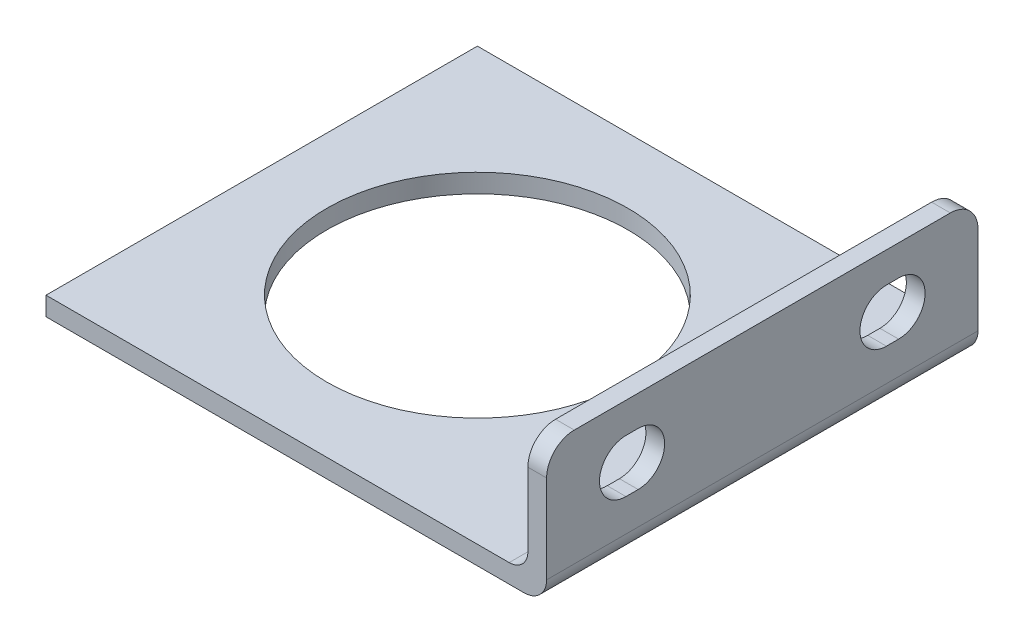
ISO-10303-21;
HEADER;
FILE_DESCRIPTION(('STEP AP214'),'2;1');
FILE_NAME('part.step','',(''),(''),'','','');
FILE_SCHEMA(('AUTOMOTIVE_DESIGN { 1 0 10303 214 1 1 1 1 }'));
ENDSEC;
DATA;
#1=APPLICATION_CONTEXT('core data for automotive mechanical design processes');
#2=APPLICATION_PROTOCOL_DEFINITION('international standard','automotive_design',2000,#1);
#3=PRODUCT_CONTEXT('',#1,'mechanical');
#4=PRODUCT('Part','Part','',(#3));
#5=PRODUCT_RELATED_PRODUCT_CATEGORY('part','',(#4));
#6=PRODUCT_DEFINITION_FORMATION('','',#4);
#7=PRODUCT_DEFINITION_CONTEXT('part definition',#1,'design');
#8=PRODUCT_DEFINITION('design','',#6,#7);
#9=PRODUCT_DEFINITION_SHAPE('','',#8);
#10=(LENGTH_UNIT() NAMED_UNIT(*) SI_UNIT(.MILLI.,.METRE.));
#11=(NAMED_UNIT(*) PLANE_ANGLE_UNIT() SI_UNIT($,.RADIAN.));
#12=(NAMED_UNIT(*) SI_UNIT($,.STERADIAN.) SOLID_ANGLE_UNIT());
#13=UNCERTAINTY_MEASURE_WITH_UNIT(LENGTH_MEASURE(1.E-05),#10,'distance_accuracy_value','');
#14=(GEOMETRIC_REPRESENTATION_CONTEXT(3) GLOBAL_UNCERTAINTY_ASSIGNED_CONTEXT((#13)) GLOBAL_UNIT_ASSIGNED_CONTEXT((#10,
#11,#12)) REPRESENTATION_CONTEXT('',''));
#15=CARTESIAN_POINT('',(0.,0.,0.));
#16=DIRECTION('',(0.,0.,1.));
#17=DIRECTION('',(1.,0.,0.));
#18=AXIS2_PLACEMENT_3D('',#15,#16,#17);
#19=CARTESIAN_POINT('',(35.,2.76,26.5));
#20=DIRECTION('',(-1.,0.,0.));
#21=DIRECTION('',(0.,0.,1.));
#22=AXIS2_PLACEMENT_3D('',#19,#20,#21);
#23=PLANE('',#22);
#24=CARTESIAN_POINT('',(35.,10.,-15.25));
#25=DIRECTION('',(1.,0.,0.));
#26=DIRECTION('',(0.,0.,-1.));
#27=AXIS2_PLACEMENT_3D('',#24,#25,#26);
#28=CIRCLE('',#27,3.25);
#29=CARTESIAN_POINT('',(35.,13.25,-15.25));
#30=VERTEX_POINT('',#29);
#31=CARTESIAN_POINT('',(35.,6.75,-15.25));
#32=VERTEX_POINT('',#31);
#33=EDGE_CURVE('E206',#30,#32,#28,.T.);
#34=ORIENTED_EDGE('',*,*,#33,.F.);
#35=DIRECTION('',(0.,0.,1.));
#36=VECTOR('',#35,1.);
#37=CARTESIAN_POINT('',(35.,13.25,-16.75));
#38=LINE('',#37,#36);
#39=CARTESIAN_POINT('',(35.,13.25,-16.75));
#40=VERTEX_POINT('',#39);
#41=EDGE_CURVE('E213',#40,#30,#38,.T.);
#42=ORIENTED_EDGE('',*,*,#41,.F.);
#43=CARTESIAN_POINT('',(35.,10.,-16.75));
#44=DIRECTION('',(1.,0.,0.));
#45=DIRECTION('',(0.,0.,-1.));
#46=AXIS2_PLACEMENT_3D('',#43,#44,#45);
#47=CIRCLE('',#46,3.25);
#48=CARTESIAN_POINT('',(35.,6.75,-16.75));
#49=VERTEX_POINT('',#48);
#50=EDGE_CURVE('E228',#49,#40,#47,.T.);
#51=ORIENTED_EDGE('',*,*,#50,.F.);
#52=DIRECTION('',(0.,0.,-1.));
#53=VECTOR('',#52,1.);
#54=CARTESIAN_POINT('',(35.,6.75,-15.25));
#55=LINE('',#54,#53);
#56=EDGE_CURVE('E225',#32,#49,#55,.T.);
#57=ORIENTED_EDGE('',*,*,#56,.F.);
#58=EDGE_LOOP('',(#34,#42,#51,#57));
#59=FACE_BOUND('',#58,.T.);
#60=CARTESIAN_POINT('',(35.,10.,16.75));
#61=DIRECTION('',(1.,0.,0.));
#62=DIRECTION('',(0.,0.,-1.));
#63=AXIS2_PLACEMENT_3D('',#60,#61,#62);
#64=CIRCLE('',#63,3.25);
#65=CARTESIAN_POINT('',(35.,13.25,16.75));
#66=VERTEX_POINT('',#65);
#67=CARTESIAN_POINT('',(35.,6.75,16.75));
#68=VERTEX_POINT('',#67);
#69=EDGE_CURVE('E235',#66,#68,#64,.T.);
#70=ORIENTED_EDGE('',*,*,#69,.F.);
#71=DIRECTION('',(0.,0.,1.));
#72=VECTOR('',#71,1.);
#73=CARTESIAN_POINT('',(35.,13.25,15.25));
#74=LINE('',#73,#72);
#75=CARTESIAN_POINT('',(35.,13.25,15.25));
#76=VERTEX_POINT('',#75);
#77=EDGE_CURVE('E245',#76,#66,#74,.T.);
#78=ORIENTED_EDGE('',*,*,#77,.F.);
#79=CARTESIAN_POINT('',(35.,10.,15.25));
#80=DIRECTION('',(1.,0.,0.));
#81=DIRECTION('',(0.,0.,-1.));
#82=AXIS2_PLACEMENT_3D('',#79,#80,#81);
#83=CIRCLE('',#82,3.25);
#84=CARTESIAN_POINT('',(35.,6.75,15.25));
#85=VERTEX_POINT('',#84);
#86=EDGE_CURVE('E260',#85,#76,#83,.T.);
#87=ORIENTED_EDGE('',*,*,#86,.F.);
#88=DIRECTION('',(0.,0.,-1.));
#89=VECTOR('',#88,1.);
#90=CARTESIAN_POINT('',(35.,6.75,16.75));
#91=LINE('',#90,#89);
#92=EDGE_CURVE('E257',#68,#85,#91,.T.);
#93=ORIENTED_EDGE('',*,*,#92,.F.);
#94=EDGE_LOOP('',(#70,#78,#87,#93));
#95=FACE_BOUND('',#94,.T.);
#96=CARTESIAN_POINT('',(35.,13.6,23.1));
#97=DIRECTION('',(1.,0.,0.));
#98=DIRECTION('',(0.,0.,-1.));
#99=AXIS2_PLACEMENT_3D('',#96,#97,#98);
#100=CIRCLE('',#99,3.39999999999999);
#101=CARTESIAN_POINT('',(35.,17.,23.1));
#102=VERTEX_POINT('',#101);
#103=CARTESIAN_POINT('',(35.,13.6,26.5));
#104=VERTEX_POINT('',#103);
#105=EDGE_CURVE('E163',#102,#104,#100,.T.);
#106=ORIENTED_EDGE('',*,*,#105,.T.);
#107=DIRECTION('',(0.,1.,0.));
#108=VECTOR('',#107,1.);
#109=CARTESIAN_POINT('',(35.,2.76,26.5));
#110=LINE('',#109,#108);
#111=CARTESIAN_POINT('',(35.,2.76,26.5));
#112=VERTEX_POINT('',#111);
#113=EDGE_CURVE('E293',#112,#104,#110,.T.);
#114=ORIENTED_EDGE('',*,*,#113,.F.);
#115=DIRECTION('',(0.,0.,-1.));
#116=VECTOR('',#115,1.);
#117=CARTESIAN_POINT('',(35.,2.76,26.5));
#118=LINE('',#117,#116);
#119=CARTESIAN_POINT('',(35.,2.76,-26.5));
#120=VERTEX_POINT('',#119);
#121=EDGE_CURVE('E175',#112,#120,#118,.T.);
#122=ORIENTED_EDGE('',*,*,#121,.T.);
#123=DIRECTION('',(0.,1.,0.));
#124=VECTOR('',#123,1.);
#125=CARTESIAN_POINT('',(35.,2.76,-26.5));
#126=LINE('',#125,#124);
#127=CARTESIAN_POINT('',(35.,13.6,-26.5));
#128=VERTEX_POINT('',#127);
#129=EDGE_CURVE('E171',#120,#128,#126,.T.);
#130=ORIENTED_EDGE('',*,*,#129,.T.);
#131=CARTESIAN_POINT('',(35.,13.6,-23.1));
#132=DIRECTION('',(1.,0.,0.));
#133=DIRECTION('',(0.,0.,-1.));
#134=AXIS2_PLACEMENT_3D('',#131,#132,#133);
#135=CIRCLE('',#134,3.39999999999999);
#136=CARTESIAN_POINT('',(35.,17.,-23.1));
#137=VERTEX_POINT('',#136);
#138=EDGE_CURVE('E54',#128,#137,#135,.T.);
#139=ORIENTED_EDGE('',*,*,#138,.T.);
#140=DIRECTION('',(0.,0.,-1.));
#141=VECTOR('',#140,1.);
#142=CARTESIAN_POINT('',(35.,17.,26.5));
#143=LINE('',#142,#141);
#144=EDGE_CURVE('E169',#102,#137,#143,.T.);
#145=ORIENTED_EDGE('',*,*,#144,.F.);
#146=EDGE_LOOP('',(#106,#114,#122,#130,#139,#145));
#147=FACE_BOUND('',#146,.T.);
#148=ADVANCED_FACE('F32',(#59,#95,#147),#23,.F.);
#149=CARTESIAN_POINT('',(35.,17.,26.5));
#150=DIRECTION('',(0.,-1.,0.));
#151=DIRECTION('',(0.,0.,-1.));
#152=AXIS2_PLACEMENT_3D('',#149,#150,#151);
#153=PLANE('',#152);
#154=DIRECTION('',(0.,0.,-1.));
#155=VECTOR('',#154,1.);
#156=CARTESIAN_POINT('',(32.7,17.,26.5));
#157=LINE('',#156,#155);
#158=CARTESIAN_POINT('',(32.7,17.,23.1));
#159=VERTEX_POINT('',#158);
#160=CARTESIAN_POINT('',(32.7,17.,-23.1));
#161=VERTEX_POINT('',#160);
#162=EDGE_CURVE('E176',#159,#161,#157,.T.);
#163=ORIENTED_EDGE('',*,*,#162,.F.);
#164=DIRECTION('',(1.,0.,0.));
#165=VECTOR('',#164,1.);
#166=CARTESIAN_POINT('',(31.7,17.,23.1));
#167=LINE('',#166,#165);
#168=EDGE_CURVE('E162',#159,#102,#167,.T.);
#169=ORIENTED_EDGE('',*,*,#168,.T.);
#170=ORIENTED_EDGE('',*,*,#144,.T.);
#171=DIRECTION('',(1.,0.,0.));
#172=VECTOR('',#171,1.);
#173=CARTESIAN_POINT('',(31.7,17.,-23.1));
#174=LINE('',#173,#172);
#175=EDGE_CURVE('E154',#161,#137,#174,.T.);
#176=ORIENTED_EDGE('',*,*,#175,.F.);
#177=EDGE_LOOP('',(#163,#169,#170,#176));
#178=FACE_BOUND('',#177,.T.);
#179=ADVANCED_FACE('F174',(#178),#153,.F.);
#180=CARTESIAN_POINT('',(32.7,17.,26.5));
#181=DIRECTION('',(1.,0.,0.));
#182=DIRECTION('',(0.,0.,-1.));
#183=AXIS2_PLACEMENT_3D('',#180,#181,#182);
#184=PLANE('',#183);
#185=CARTESIAN_POINT('',(32.7,10.,-16.75));
#186=DIRECTION('',(1.,0.,0.));
#187=DIRECTION('',(0.,0.,-1.));
#188=AXIS2_PLACEMENT_3D('',#185,#186,#187);
#189=CIRCLE('',#188,3.25);
#190=CARTESIAN_POINT('',(32.7,6.75,-16.75));
#191=VERTEX_POINT('',#190);
#192=CARTESIAN_POINT('',(32.7,13.25,-16.75));
#193=VERTEX_POINT('',#192);
#194=EDGE_CURVE('E216',#191,#193,#189,.T.);
#195=ORIENTED_EDGE('',*,*,#194,.T.);
#196=DIRECTION('',(0.,0.,1.));
#197=VECTOR('',#196,1.);
#198=CARTESIAN_POINT('',(32.7,13.25,-16.75));
#199=LINE('',#198,#197);
#200=CARTESIAN_POINT('',(32.7,13.25,-15.25));
#201=VERTEX_POINT('',#200);
#202=EDGE_CURVE('E219',#193,#201,#199,.T.);
#203=ORIENTED_EDGE('',*,*,#202,.T.);
#204=CARTESIAN_POINT('',(32.7,10.,-15.25));
#205=DIRECTION('',(1.,0.,0.));
#206=DIRECTION('',(0.,0.,-1.));
#207=AXIS2_PLACEMENT_3D('',#204,#205,#206);
#208=CIRCLE('',#207,3.25);
#209=CARTESIAN_POINT('',(32.7,6.75,-15.25));
#210=VERTEX_POINT('',#209);
#211=EDGE_CURVE('E209',#201,#210,#208,.T.);
#212=ORIENTED_EDGE('',*,*,#211,.T.);
#213=DIRECTION('',(0.,0.,-1.));
#214=VECTOR('',#213,1.);
#215=CARTESIAN_POINT('',(32.7,6.75,-15.25));
#216=LINE('',#215,#214);
#217=EDGE_CURVE('E212',#210,#191,#216,.T.);
#218=ORIENTED_EDGE('',*,*,#217,.T.);
#219=EDGE_LOOP('',(#195,#203,#212,#218));
#220=FACE_BOUND('',#219,.T.);
#221=CARTESIAN_POINT('',(32.7,10.,15.25));
#222=DIRECTION('',(1.,0.,0.));
#223=DIRECTION('',(0.,0.,-1.));
#224=AXIS2_PLACEMENT_3D('',#221,#222,#223);
#225=CIRCLE('',#224,3.25);
#226=CARTESIAN_POINT('',(32.7,6.75,15.25));
#227=VERTEX_POINT('',#226);
#228=CARTESIAN_POINT('',(32.7,13.25,15.25));
#229=VERTEX_POINT('',#228);
#230=EDGE_CURVE('E248',#227,#229,#225,.T.);
#231=ORIENTED_EDGE('',*,*,#230,.T.);
#232=DIRECTION('',(0.,0.,1.));
#233=VECTOR('',#232,1.);
#234=CARTESIAN_POINT('',(32.7,13.25,15.25));
#235=LINE('',#234,#233);
#236=CARTESIAN_POINT('',(32.7,13.25,16.75));
#237=VERTEX_POINT('',#236);
#238=EDGE_CURVE('E251',#229,#237,#235,.T.);
#239=ORIENTED_EDGE('',*,*,#238,.T.);
#240=CARTESIAN_POINT('',(32.7,10.,16.75));
#241=DIRECTION('',(1.,0.,0.));
#242=DIRECTION('',(0.,0.,-1.));
#243=AXIS2_PLACEMENT_3D('',#240,#241,#242);
#244=CIRCLE('',#243,3.25);
#245=CARTESIAN_POINT('',(32.7,6.75,16.75));
#246=VERTEX_POINT('',#245);
#247=EDGE_CURVE('E241',#237,#246,#244,.T.);
#248=ORIENTED_EDGE('',*,*,#247,.T.);
#249=DIRECTION('',(0.,0.,-1.));
#250=VECTOR('',#249,1.);
#251=CARTESIAN_POINT('',(32.7,6.75,16.75));
#252=LINE('',#251,#250);
#253=EDGE_CURVE('E244',#246,#227,#252,.T.);
#254=ORIENTED_EDGE('',*,*,#253,.T.);
#255=EDGE_LOOP('',(#231,#239,#248,#254));
#256=FACE_BOUND('',#255,.T.);
#257=CARTESIAN_POINT('',(32.7,13.6,23.1));
#258=DIRECTION('',(1.,0.,0.));
#259=DIRECTION('',(0.,0.,-1.));
#260=AXIS2_PLACEMENT_3D('',#257,#258,#259);
#261=CIRCLE('',#260,3.39999999999999);
#262=CARTESIAN_POINT('',(32.7,13.6,26.5));
#263=VERTEX_POINT('',#262);
#264=EDGE_CURVE('E46',#159,#263,#261,.T.);
#265=ORIENTED_EDGE('',*,*,#264,.F.);
#266=ORIENTED_EDGE('',*,*,#162,.T.);
#267=CARTESIAN_POINT('',(32.7,13.6,-23.1));
#268=DIRECTION('',(1.,0.,0.));
#269=DIRECTION('',(0.,0.,-1.));
#270=AXIS2_PLACEMENT_3D('',#267,#268,#269);
#271=CIRCLE('',#270,3.39999999999999);
#272=CARTESIAN_POINT('',(32.7,13.6,-26.5));
#273=VERTEX_POINT('',#272);
#274=EDGE_CURVE('E157',#273,#161,#271,.T.);
#275=ORIENTED_EDGE('',*,*,#274,.F.);
#276=DIRECTION('',(0.,-1.,0.));
#277=VECTOR('',#276,1.);
#278=CARTESIAN_POINT('',(32.7,17.,-26.5));
#279=LINE('',#278,#277);
#280=CARTESIAN_POINT('',(32.7,4.6,-26.5));
#281=VERTEX_POINT('',#280);
#282=EDGE_CURVE('E193',#273,#281,#279,.T.);
#283=ORIENTED_EDGE('',*,*,#282,.T.);
#284=DIRECTION('',(0.,0.,-1.));
#285=VECTOR('',#284,1.);
#286=CARTESIAN_POINT('',(32.7,4.6,26.5));
#287=LINE('',#286,#285);
#288=CARTESIAN_POINT('',(32.7,4.6,26.5));
#289=VERTEX_POINT('',#288);
#290=EDGE_CURVE('E180',#289,#281,#287,.T.);
#291=ORIENTED_EDGE('',*,*,#290,.F.);
#292=DIRECTION('',(0.,-1.,0.));
#293=VECTOR('',#292,1.);
#294=CARTESIAN_POINT('',(32.7,17.,26.5));
#295=LINE('',#294,#293);
#296=EDGE_CURVE('E296',#263,#289,#295,.T.);
#297=ORIENTED_EDGE('',*,*,#296,.F.);
#298=EDGE_LOOP('',(#265,#266,#275,#283,#291,#297));
#299=FACE_BOUND('',#298,.T.);
#300=ADVANCED_FACE('F195',(#220,#256,#299),#184,.F.);
#301=CARTESIAN_POINT('',(-26.5,0.,26.5));
#302=DIRECTION('',(0.,1.,0.));
#303=DIRECTION('',(0.,0.,1.));
#304=AXIS2_PLACEMENT_3D('',#301,#302,#303);
#305=PLANE('',#304);
#306=DIRECTION('',(0.,0.,-1.));
#307=VECTOR('',#306,1.);
#308=CARTESIAN_POINT('',(32.24,0.,26.5));
#309=LINE('',#308,#307);
#310=CARTESIAN_POINT('',(32.24,0.,26.5));
#311=VERTEX_POINT('',#310);
#312=CARTESIAN_POINT('',(32.24,0.,-26.5));
#313=VERTEX_POINT('',#312);
#314=EDGE_CURVE('E178',#311,#313,#309,.T.);
#315=ORIENTED_EDGE('',*,*,#314,.F.);
#316=DIRECTION('',(1.,0.,0.));
#317=VECTOR('',#316,1.);
#318=CARTESIAN_POINT('',(-26.5,0.,26.5));
#319=LINE('',#318,#317);
#320=CARTESIAN_POINT('',(-26.5,0.,26.5));
#321=VERTEX_POINT('',#320);
#322=EDGE_CURVE('E289',#321,#311,#319,.T.);
#323=ORIENTED_EDGE('',*,*,#322,.F.);
#324=DIRECTION('',(0.,0.,-1.));
#325=VECTOR('',#324,1.);
#326=CARTESIAN_POINT('',(-26.5,0.,26.5));
#327=LINE('',#326,#325);
#328=CARTESIAN_POINT('',(-26.5,0.,-26.5));
#329=VERTEX_POINT('',#328);
#330=EDGE_CURVE('E186',#321,#329,#327,.T.);
#331=ORIENTED_EDGE('',*,*,#330,.T.);
#332=DIRECTION('',(1.,0.,0.));
#333=VECTOR('',#332,1.);
#334=CARTESIAN_POINT('',(-26.5,0.,-26.5));
#335=LINE('',#334,#333);
#336=EDGE_CURVE('E275',#329,#313,#335,.T.);
#337=ORIENTED_EDGE('',*,*,#336,.T.);
#338=EDGE_LOOP('',(#315,#323,#331,#337));
#339=FACE_BOUND('',#338,.T.);
#340=CARTESIAN_POINT('',(0.,0.,0.));
#341=DIRECTION('',(0.,1.,0.));
#342=DIRECTION('',(0.,0.,1.));
#343=AXIS2_PLACEMENT_3D('',#340,#341,#342);
#344=CIRCLE('',#343,18.5);
#345=CARTESIAN_POINT('',(0.,0.,18.5));
#346=VERTEX_POINT('',#345);
#347=EDGE_CURVE('E199',#346,#346,#344,.T.);
#348=ORIENTED_EDGE('',*,*,#347,.T.);
#349=EDGE_LOOP('',(#348));
#350=FACE_BOUND('',#349,.T.);
#351=ADVANCED_FACE('F333',(#339,#350),#305,.F.);
#352=CARTESIAN_POINT('',(30.4,2.3,26.5));
#353=DIRECTION('',(0.,-1.,0.));
#354=DIRECTION('',(1.,0.,0.));
#355=AXIS2_PLACEMENT_3D('',#352,#353,#354);
#356=PLANE('',#355);
#357=DIRECTION('',(0.,0.,-1.));
#358=VECTOR('',#357,1.);
#359=CARTESIAN_POINT('',(30.4,2.3,26.5));
#360=LINE('',#359,#358);
#361=CARTESIAN_POINT('',(30.4,2.3,26.5));
#362=VERTEX_POINT('',#361);
#363=CARTESIAN_POINT('',(30.4,2.3,-26.5));
#364=VERTEX_POINT('',#363);
#365=EDGE_CURVE('E304',#362,#364,#360,.T.);
#366=ORIENTED_EDGE('',*,*,#365,.T.);
#367=DIRECTION('',(-1.,0.,0.));
#368=VECTOR('',#367,1.);
#369=CARTESIAN_POINT('',(30.4,2.3,-26.5));
#370=LINE('',#369,#368);
#371=CARTESIAN_POINT('',(-26.5,2.3,-26.5));
#372=VERTEX_POINT('',#371);
#373=EDGE_CURVE('E283',#364,#372,#370,.T.);
#374=ORIENTED_EDGE('',*,*,#373,.T.);
#375=DIRECTION('',(0.,0.,-1.));
#376=VECTOR('',#375,1.);
#377=CARTESIAN_POINT('',(-26.5,2.3,26.5));
#378=LINE('',#377,#376);
#379=CARTESIAN_POINT('',(-26.5,2.3,26.5));
#380=VERTEX_POINT('',#379);
#381=EDGE_CURVE('E302',#380,#372,#378,.T.);
#382=ORIENTED_EDGE('',*,*,#381,.F.);
#383=DIRECTION('',(-1.,0.,0.));
#384=VECTOR('',#383,1.);
#385=CARTESIAN_POINT('',(30.4,2.3,26.5));
#386=LINE('',#385,#384);
#387=EDGE_CURVE('E300',#362,#380,#386,.T.);
#388=ORIENTED_EDGE('',*,*,#387,.F.);
#389=EDGE_LOOP('',(#366,#374,#382,#388));
#390=FACE_BOUND('',#389,.T.);
#391=CARTESIAN_POINT('',(0.,2.3,0.));
#392=DIRECTION('',(0.,1.,0.));
#393=DIRECTION('',(0.,0.,1.));
#394=AXIS2_PLACEMENT_3D('',#391,#392,#393);
#395=CIRCLE('',#394,18.5);
#396=CARTESIAN_POINT('',(0.,2.3,18.5));
#397=VERTEX_POINT('',#396);
#398=EDGE_CURVE('E203',#397,#397,#395,.T.);
#399=ORIENTED_EDGE('',*,*,#398,.F.);
#400=EDGE_LOOP('',(#399));
#401=FACE_BOUND('',#400,.T.);
#402=ADVANCED_FACE('F316',(#390,#401),#356,.F.);
#403=CARTESIAN_POINT('',(-26.5,2.3,26.5));
#404=DIRECTION('',(1.,0.,0.));
#405=DIRECTION('',(0.,1.,0.));
#406=AXIS2_PLACEMENT_3D('',#403,#404,#405);
#407=PLANE('',#406);
#408=ORIENTED_EDGE('',*,*,#381,.T.);
#409=DIRECTION('',(0.,-1.,0.));
#410=VECTOR('',#409,1.);
#411=CARTESIAN_POINT('',(-26.5,2.3,-26.5));
#412=LINE('',#411,#410);
#413=EDGE_CURVE('E267',#372,#329,#412,.T.);
#414=ORIENTED_EDGE('',*,*,#413,.T.);
#415=ORIENTED_EDGE('',*,*,#330,.F.);
#416=DIRECTION('',(0.,-1.,0.));
#417=VECTOR('',#416,1.);
#418=CARTESIAN_POINT('',(-26.5,2.3,26.5));
#419=LINE('',#418,#417);
#420=EDGE_CURVE('E286',#380,#321,#419,.T.);
#421=ORIENTED_EDGE('',*,*,#420,.F.);
#422=EDGE_LOOP('',(#408,#414,#415,#421));
#423=FACE_BOUND('',#422,.T.);
#424=ADVANCED_FACE('F34',(#423),#407,.F.);
#425=CARTESIAN_POINT('',(32.24,2.76,26.5));
#426=DIRECTION('',(0.,0.,-1.));
#427=DIRECTION('',(-1.,0.,0.));
#428=AXIS2_PLACEMENT_3D('',#425,#426,#427);
#429=CYLINDRICAL_SURFACE('',#428,2.76);
#430=ORIENTED_EDGE('',*,*,#314,.T.);
#431=CARTESIAN_POINT('',(32.24,2.76,-26.5));
#432=DIRECTION('',(0.,0.,1.));
#433=DIRECTION('',(1.,0.,0.));
#434=AXIS2_PLACEMENT_3D('',#431,#432,#433);
#435=CIRCLE('',#434,2.76);
#436=EDGE_CURVE('E277',#313,#120,#435,.T.);
#437=ORIENTED_EDGE('',*,*,#436,.T.);
#438=ORIENTED_EDGE('',*,*,#121,.F.);
#439=CARTESIAN_POINT('',(32.24,2.76,26.5));
#440=DIRECTION('',(0.,0.,1.));
#441=DIRECTION('',(1.,0.,0.));
#442=AXIS2_PLACEMENT_3D('',#439,#440,#441);
#443=CIRCLE('',#442,2.76);
#444=EDGE_CURVE('E291',#311,#112,#443,.T.);
#445=ORIENTED_EDGE('',*,*,#444,.F.);
#446=EDGE_LOOP('',(#430,#437,#438,#445));
#447=FACE_BOUND('',#446,.T.);
#448=ADVANCED_FACE('F329',(#447),#429,.T.);
#449=CARTESIAN_POINT('',(30.4,4.6,26.5));
#450=DIRECTION('',(0.,0.,-1.));
#451=DIRECTION('',(-1.,0.,0.));
#452=AXIS2_PLACEMENT_3D('',#449,#450,#451);
#453=CYLINDRICAL_SURFACE('',#452,2.3);
#454=ORIENTED_EDGE('',*,*,#290,.T.);
#455=CARTESIAN_POINT('',(30.4,4.6,-26.5));
#456=DIRECTION('',(0.,0.,-1.));
#457=DIRECTION('',(-1.,0.,0.));
#458=AXIS2_PLACEMENT_3D('',#455,#456,#457);
#459=CIRCLE('',#458,2.3);
#460=EDGE_CURVE('E281',#281,#364,#459,.T.);
#461=ORIENTED_EDGE('',*,*,#460,.T.);
#462=ORIENTED_EDGE('',*,*,#365,.F.);
#463=CARTESIAN_POINT('',(30.4,4.6,26.5));
#464=DIRECTION('',(0.,0.,-1.));
#465=DIRECTION('',(-1.,0.,0.));
#466=AXIS2_PLACEMENT_3D('',#463,#464,#465);
#467=CIRCLE('',#466,2.3);
#468=EDGE_CURVE('E298',#289,#362,#467,.T.);
#469=ORIENTED_EDGE('',*,*,#468,.F.);
#470=EDGE_LOOP('',(#454,#461,#462,#469));
#471=FACE_BOUND('',#470,.T.);
#472=ADVANCED_FACE('F308',(#471),#453,.F.);
#473=CARTESIAN_POINT('',(32.24,2.76,26.5));
#474=DIRECTION('',(0.,0.,1.));
#475=DIRECTION('',(1.,0.,0.));
#476=AXIS2_PLACEMENT_3D('',#473,#474,#475);
#477=PLANE('',#476);
#478=ORIENTED_EDGE('',*,*,#468,.T.);
#479=ORIENTED_EDGE('',*,*,#387,.T.);
#480=ORIENTED_EDGE('',*,*,#420,.T.);
#481=ORIENTED_EDGE('',*,*,#322,.T.);
#482=ORIENTED_EDGE('',*,*,#444,.T.);
#483=ORIENTED_EDGE('',*,*,#113,.T.);
#484=DIRECTION('',(1.,0.,0.));
#485=VECTOR('',#484,1.);
#486=CARTESIAN_POINT('',(31.7,13.6,26.5));
#487=LINE('',#486,#485);
#488=EDGE_CURVE('E11',#263,#104,#487,.T.);
#489=ORIENTED_EDGE('',*,*,#488,.F.);
#490=ORIENTED_EDGE('',*,*,#296,.T.);
#491=EDGE_LOOP('',(#478,#479,#480,#481,#482,#483,#489,#490));
#492=FACE_BOUND('',#491,.T.);
#493=ADVANCED_FACE('F321',(#492),#477,.T.);
#494=CARTESIAN_POINT('',(32.24,2.76,-26.5));
#495=DIRECTION('',(0.,0.,1.));
#496=DIRECTION('',(1.,0.,0.));
#497=AXIS2_PLACEMENT_3D('',#494,#495,#496);
#498=PLANE('',#497);
#499=ORIENTED_EDGE('',*,*,#436,.F.);
#500=ORIENTED_EDGE('',*,*,#336,.F.);
#501=ORIENTED_EDGE('',*,*,#413,.F.);
#502=ORIENTED_EDGE('',*,*,#373,.F.);
#503=ORIENTED_EDGE('',*,*,#460,.F.);
#504=ORIENTED_EDGE('',*,*,#282,.F.);
#505=DIRECTION('',(1.,0.,0.));
#506=VECTOR('',#505,1.);
#507=CARTESIAN_POINT('',(31.7,13.6,-26.5));
#508=LINE('',#507,#506);
#509=EDGE_CURVE('E40',#273,#128,#508,.T.);
#510=ORIENTED_EDGE('',*,*,#509,.T.);
#511=ORIENTED_EDGE('',*,*,#129,.F.);
#512=EDGE_LOOP('',(#499,#500,#501,#502,#503,#504,#510,#511));
#513=FACE_BOUND('',#512,.T.);
#514=ADVANCED_FACE('F190',(#513),#498,.F.);
#515=CARTESIAN_POINT('',(32.7,13.25,15.25));
#516=DIRECTION('',(0.,1.,0.));
#517=DIRECTION('',(0.,0.,1.));
#518=AXIS2_PLACEMENT_3D('',#515,#516,#517);
#519=PLANE('',#518);
#520=ORIENTED_EDGE('',*,*,#77,.T.);
#521=DIRECTION('',(1.,0.,0.));
#522=VECTOR('',#521,1.);
#523=CARTESIAN_POINT('',(32.7,13.25,16.75));
#524=LINE('',#523,#522);
#525=EDGE_CURVE('E264',#237,#66,#524,.T.);
#526=ORIENTED_EDGE('',*,*,#525,.F.);
#527=ORIENTED_EDGE('',*,*,#238,.F.);
#528=DIRECTION('',(1.,0.,0.));
#529=VECTOR('',#528,1.);
#530=CARTESIAN_POINT('',(32.7,13.25,15.25));
#531=LINE('',#530,#529);
#532=EDGE_CURVE('E268',#229,#76,#531,.T.);
#533=ORIENTED_EDGE('',*,*,#532,.T.);
#534=EDGE_LOOP('',(#520,#526,#527,#533));
#535=FACE_BOUND('',#534,.T.);
#536=ADVANCED_FACE('F390',(#535),#519,.F.);
#537=CARTESIAN_POINT('',(32.7,10.,15.25));
#538=DIRECTION('',(1.,0.,0.));
#539=DIRECTION('',(0.,0.,-1.));
#540=AXIS2_PLACEMENT_3D('',#537,#538,#539);
#541=CYLINDRICAL_SURFACE('',#540,3.25);
#542=ORIENTED_EDGE('',*,*,#86,.T.);
#543=ORIENTED_EDGE('',*,*,#532,.F.);
#544=ORIENTED_EDGE('',*,*,#230,.F.);
#545=DIRECTION('',(1.,0.,0.));
#546=VECTOR('',#545,1.);
#547=CARTESIAN_POINT('',(32.7,6.75,15.25));
#548=LINE('',#547,#546);
#549=EDGE_CURVE('E270',#227,#85,#548,.T.);
#550=ORIENTED_EDGE('',*,*,#549,.T.);
#551=EDGE_LOOP('',(#542,#543,#544,#550));
#552=FACE_BOUND('',#551,.T.);
#553=ADVANCED_FACE('F386',(#552),#541,.F.);
#554=CARTESIAN_POINT('',(32.7,6.75,16.75));
#555=DIRECTION('',(0.,-1.,0.));
#556=DIRECTION('',(0.,0.,-1.));
#557=AXIS2_PLACEMENT_3D('',#554,#555,#556);
#558=PLANE('',#557);
#559=ORIENTED_EDGE('',*,*,#92,.T.);
#560=ORIENTED_EDGE('',*,*,#549,.F.);
#561=ORIENTED_EDGE('',*,*,#253,.F.);
#562=DIRECTION('',(1.,0.,0.));
#563=VECTOR('',#562,1.);
#564=CARTESIAN_POINT('',(32.7,6.75,16.75));
#565=LINE('',#564,#563);
#566=EDGE_CURVE('E254',#246,#68,#565,.T.);
#567=ORIENTED_EDGE('',*,*,#566,.T.);
#568=EDGE_LOOP('',(#559,#560,#561,#567));
#569=FACE_BOUND('',#568,.T.);
#570=ADVANCED_FACE('F398',(#569),#558,.F.);
#571=CARTESIAN_POINT('',(32.7,10.,16.75));
#572=DIRECTION('',(1.,0.,0.));
#573=DIRECTION('',(0.,0.,-1.));
#574=AXIS2_PLACEMENT_3D('',#571,#572,#573);
#575=CYLINDRICAL_SURFACE('',#574,3.25);
#576=ORIENTED_EDGE('',*,*,#69,.T.);
#577=ORIENTED_EDGE('',*,*,#566,.F.);
#578=ORIENTED_EDGE('',*,*,#247,.F.);
#579=ORIENTED_EDGE('',*,*,#525,.T.);
#580=EDGE_LOOP('',(#576,#577,#578,#579));
#581=FACE_BOUND('',#580,.T.);
#582=ADVANCED_FACE('F395',(#581),#575,.F.);
#583=CARTESIAN_POINT('',(32.7,13.25,-16.75));
#584=DIRECTION('',(0.,1.,0.));
#585=DIRECTION('',(0.,0.,1.));
#586=AXIS2_PLACEMENT_3D('',#583,#584,#585);
#587=PLANE('',#586);
#588=ORIENTED_EDGE('',*,*,#41,.T.);
#589=DIRECTION('',(1.,0.,0.));
#590=VECTOR('',#589,1.);
#591=CARTESIAN_POINT('',(32.7,13.25,-15.25));
#592=LINE('',#591,#590);
#593=EDGE_CURVE('E232',#201,#30,#592,.T.);
#594=ORIENTED_EDGE('',*,*,#593,.F.);
#595=ORIENTED_EDGE('',*,*,#202,.F.);
#596=DIRECTION('',(1.,0.,0.));
#597=VECTOR('',#596,1.);
#598=CARTESIAN_POINT('',(32.7,13.25,-16.75));
#599=LINE('',#598,#597);
#600=EDGE_CURVE('E236',#193,#40,#599,.T.);
#601=ORIENTED_EDGE('',*,*,#600,.T.);
#602=EDGE_LOOP('',(#588,#594,#595,#601));
#603=FACE_BOUND('',#602,.T.);
#604=ADVANCED_FACE('F405',(#603),#587,.F.);
#605=CARTESIAN_POINT('',(32.7,10.,-16.75));
#606=DIRECTION('',(1.,0.,0.));
#607=DIRECTION('',(0.,0.,-1.));
#608=AXIS2_PLACEMENT_3D('',#605,#606,#607);
#609=CYLINDRICAL_SURFACE('',#608,3.25);
#610=ORIENTED_EDGE('',*,*,#50,.T.);
#611=ORIENTED_EDGE('',*,*,#600,.F.);
#612=ORIENTED_EDGE('',*,*,#194,.F.);
#613=DIRECTION('',(1.,0.,0.));
#614=VECTOR('',#613,1.);
#615=CARTESIAN_POINT('',(32.7,6.75,-16.75));
#616=LINE('',#615,#614);
#617=EDGE_CURVE('E238',#191,#49,#616,.T.);
#618=ORIENTED_EDGE('',*,*,#617,.T.);
#619=EDGE_LOOP('',(#610,#611,#612,#618));
#620=FACE_BOUND('',#619,.T.);
#621=ADVANCED_FACE('F466',(#620),#609,.F.);
#622=CARTESIAN_POINT('',(32.7,6.75,-15.25));
#623=DIRECTION('',(0.,-1.,0.));
#624=DIRECTION('',(0.,0.,-1.));
#625=AXIS2_PLACEMENT_3D('',#622,#623,#624);
#626=PLANE('',#625);
#627=ORIENTED_EDGE('',*,*,#56,.T.);
#628=ORIENTED_EDGE('',*,*,#617,.F.);
#629=ORIENTED_EDGE('',*,*,#217,.F.);
#630=DIRECTION('',(1.,0.,0.));
#631=VECTOR('',#630,1.);
#632=CARTESIAN_POINT('',(32.7,6.75,-15.25));
#633=LINE('',#632,#631);
#634=EDGE_CURVE('E222',#210,#32,#633,.T.);
#635=ORIENTED_EDGE('',*,*,#634,.T.);
#636=EDGE_LOOP('',(#627,#628,#629,#635));
#637=FACE_BOUND('',#636,.T.);
#638=ADVANCED_FACE('F348',(#637),#626,.F.);
#639=CARTESIAN_POINT('',(32.7,10.,-15.25));
#640=DIRECTION('',(1.,0.,0.));
#641=DIRECTION('',(0.,0.,-1.));
#642=AXIS2_PLACEMENT_3D('',#639,#640,#641);
#643=CYLINDRICAL_SURFACE('',#642,3.25);
#644=ORIENTED_EDGE('',*,*,#33,.T.);
#645=ORIENTED_EDGE('',*,*,#634,.F.);
#646=ORIENTED_EDGE('',*,*,#211,.F.);
#647=ORIENTED_EDGE('',*,*,#593,.T.);
#648=EDGE_LOOP('',(#644,#645,#646,#647));
#649=FACE_BOUND('',#648,.T.);
#650=ADVANCED_FACE('F340',(#649),#643,.F.);
#651=CARTESIAN_POINT('',(0.,2.3,0.));
#652=DIRECTION('',(0.,-1.,0.));
#653=DIRECTION('',(0.,0.,-1.));
#654=AXIS2_PLACEMENT_3D('',#651,#652,#653);
#655=CYLINDRICAL_SURFACE('',#654,18.5);
#656=ORIENTED_EDGE('',*,*,#398,.T.);
#657=EDGE_LOOP('',(#656));
#658=FACE_BOUND('',#657,.T.);
#659=ORIENTED_EDGE('',*,*,#347,.F.);
#660=EDGE_LOOP('',(#659));
#661=FACE_BOUND('',#660,.T.);
#662=ADVANCED_FACE('F338',(#658,#661),#655,.F.);
#663=CARTESIAN_POINT('',(31.7,13.6,-23.1));
#664=DIRECTION('',(1.,0.,0.));
#665=DIRECTION('',(0.,0.,-1.));
#666=AXIS2_PLACEMENT_3D('',#663,#664,#665);
#667=CYLINDRICAL_SURFACE('',#666,3.39999999999999);
#668=ORIENTED_EDGE('',*,*,#274,.T.);
#669=ORIENTED_EDGE('',*,*,#175,.T.);
#670=ORIENTED_EDGE('',*,*,#138,.F.);
#671=ORIENTED_EDGE('',*,*,#509,.F.);
#672=EDGE_LOOP('',(#668,#669,#670,#671));
#673=FACE_BOUND('',#672,.T.);
#674=ADVANCED_FACE('F155',(#673),#667,.T.);
#675=CARTESIAN_POINT('',(31.7,13.6,23.1));
#676=DIRECTION('',(1.,0.,0.));
#677=DIRECTION('',(0.,0.,-1.));
#678=AXIS2_PLACEMENT_3D('',#675,#676,#677);
#679=CYLINDRICAL_SURFACE('',#678,3.39999999999999);
#680=ORIENTED_EDGE('',*,*,#264,.T.);
#681=ORIENTED_EDGE('',*,*,#488,.T.);
#682=ORIENTED_EDGE('',*,*,#105,.F.);
#683=ORIENTED_EDGE('',*,*,#168,.F.);
#684=EDGE_LOOP('',(#680,#681,#682,#683));
#685=FACE_BOUND('',#684,.T.);
#686=ADVANCED_FACE('F324',(#685),#679,.T.);
#687=CLOSED_SHELL('',(#148,#179,#300,#351,#402,#424,#448,#472,#493,#514,#536,#553,#570,#582,
#604,#621,#638,#650,#662,#674,#686));
#688=MANIFOLD_SOLID_BREP('B2',#687);
#689=ADVANCED_BREP_SHAPE_REPRESENTATION('',(#18,#688),#14);
#690=SHAPE_DEFINITION_REPRESENTATION(#9,#689);
ENDSEC;
END-ISO-10303-21;
